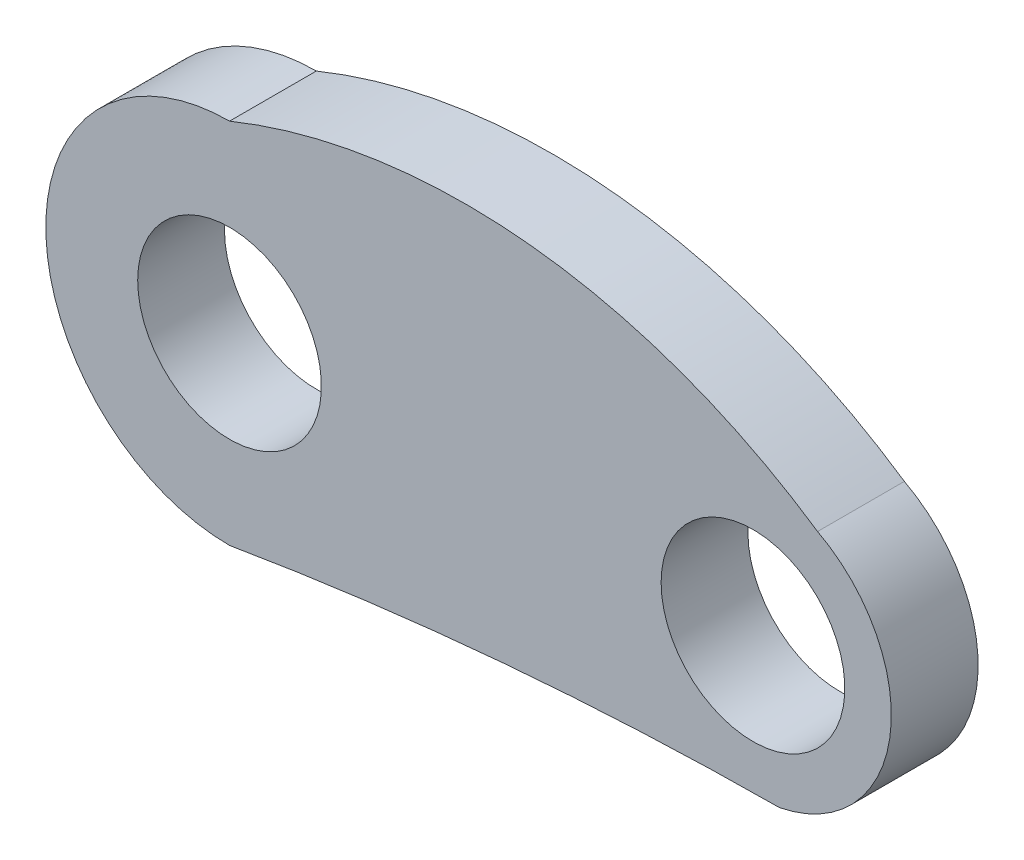
ISO-10303-21;
HEADER;
FILE_DESCRIPTION(('STEP AP214'),'2;1');
FILE_NAME('part.step','',(''),(''),'','','');
FILE_SCHEMA(('AUTOMOTIVE_DESIGN { 1 0 10303 214 1 1 1 1 }'));
ENDSEC;
DATA;
#1=APPLICATION_CONTEXT('core data for automotive mechanical design processes');
#2=APPLICATION_PROTOCOL_DEFINITION('international standard','automotive_design',2000,#1);
#3=PRODUCT_CONTEXT('',#1,'mechanical');
#4=PRODUCT('Part','Part','',(#3));
#5=PRODUCT_RELATED_PRODUCT_CATEGORY('part','',(#4));
#6=PRODUCT_DEFINITION_FORMATION('','',#4);
#7=PRODUCT_DEFINITION_CONTEXT('part definition',#1,'design');
#8=PRODUCT_DEFINITION('design','',#6,#7);
#9=PRODUCT_DEFINITION_SHAPE('','',#8);
#10=(LENGTH_UNIT() NAMED_UNIT(*) SI_UNIT(.MILLI.,.METRE.));
#11=(NAMED_UNIT(*) PLANE_ANGLE_UNIT() SI_UNIT($,.RADIAN.));
#12=(NAMED_UNIT(*) SI_UNIT($,.STERADIAN.) SOLID_ANGLE_UNIT());
#13=UNCERTAINTY_MEASURE_WITH_UNIT(LENGTH_MEASURE(1.E-05),#10,'distance_accuracy_value','');
#14=(GEOMETRIC_REPRESENTATION_CONTEXT(3) GLOBAL_UNCERTAINTY_ASSIGNED_CONTEXT((#13)) GLOBAL_UNIT_ASSIGNED_CONTEXT((#10,
#11,#12)) REPRESENTATION_CONTEXT('',''));
#15=CARTESIAN_POINT('',(0.,0.,0.));
#16=DIRECTION('',(0.,0.,1.));
#17=DIRECTION('',(1.,0.,0.));
#18=AXIS2_PLACEMENT_3D('',#15,#16,#17);
#19=CARTESIAN_POINT('',(4.08793821912339,-6.86584333762435,0.));
#20=DIRECTION('',(0.,0.,1.));
#21=DIRECTION('',(1.,0.,0.));
#22=AXIS2_PLACEMENT_3D('',#19,#20,#21);
#23=PLANE('',#22);
#24=CARTESIAN_POINT('',(0.,0.,0.));
#25=DIRECTION('',(0.,0.,-1.));
#26=DIRECTION('',(-1.,0.,0.));
#27=AXIS2_PLACEMENT_3D('',#24,#25,#26);
#28=CIRCLE('',#27,3.175);
#29=CARTESIAN_POINT('',(-3.175,0.,0.));
#30=VERTEX_POINT('',#29);
#31=EDGE_CURVE('E79',#30,#30,#28,.F.);
#32=ORIENTED_EDGE('',*,*,#31,.T.);
#33=EDGE_LOOP('',(#32));
#34=FACE_BOUND('',#33,.T.);
#35=CARTESIAN_POINT('',(18.09,0.,0.));
#36=DIRECTION('',(0.,0.,-1.));
#37=DIRECTION('',(-1.,0.,0.));
#38=AXIS2_PLACEMENT_3D('',#35,#36,#37);
#39=CIRCLE('',#38,3.175);
#40=CARTESIAN_POINT('',(14.915,0.,0.));
#41=VERTEX_POINT('',#40);
#42=EDGE_CURVE('E20',#41,#41,#39,.F.);
#43=ORIENTED_EDGE('',*,*,#42,.T.);
#44=EDGE_LOOP('',(#43));
#45=FACE_BOUND('',#44,.T.);
#46=CARTESIAN_POINT('',(18.09,0.,0.));
#47=DIRECTION('',(0.,0.,-1.));
#48=DIRECTION('',(-1.,0.,0.));
#49=AXIS2_PLACEMENT_3D('',#46,#47,#48);
#50=CIRCLE('',#49,4.78186189986877);
#51=CARTESIAN_POINT('',(19.0020450023409,-4.69407894513094,0.));
#52=VERTEX_POINT('',#51);
#53=CARTESIAN_POINT('',(20.3228957570764,4.22851980809442,0.));
#54=VERTEX_POINT('',#53);
#55=EDGE_CURVE('E60',#52,#54,#50,.F.);
#56=ORIENTED_EDGE('',*,*,#55,.F.);
#57=CARTESIAN_POINT('',(19.7231550824855,-122.823176962724,0.));
#58=DIRECTION('',(0.,0.,-1.));
#59=DIRECTION('',(-1.,0.,0.));
#60=AXIS2_PLACEMENT_3D('',#57,#58,#59);
#61=CIRCLE('',#60,118.131298977866);
#62=CARTESIAN_POINT('',(0.,-6.34999999999999,0.));
#63=VERTEX_POINT('',#62);
#64=EDGE_CURVE('E74',#52,#63,#61,.F.);
#65=ORIENTED_EDGE('',*,*,#64,.T.);
#66=CARTESIAN_POINT('',(0.,0.,0.));
#67=DIRECTION('',(0.,0.,-1.));
#68=DIRECTION('',(-1.,0.,0.));
#69=AXIS2_PLACEMENT_3D('',#66,#67,#68);
#70=CIRCLE('',#69,6.35);
#71=CARTESIAN_POINT('',(0.,6.35,0.));
#72=VERTEX_POINT('',#71);
#73=EDGE_CURVE('E61',#72,#63,#70,.F.);
#74=ORIENTED_EDGE('',*,*,#73,.F.);
#75=CARTESIAN_POINT('',(8.17587643824678,-13.7316866752487,0.));
#76=DIRECTION('',(0.,0.,-1.));
#77=DIRECTION('',(-1.,0.,0.));
#78=AXIS2_PLACEMENT_3D('',#75,#76,#77);
#79=CIRCLE('',#78,21.6822299419672);
#80=EDGE_CURVE('E56',#54,#72,#79,.F.);
#81=ORIENTED_EDGE('',*,*,#80,.F.);
#82=EDGE_LOOP('',(#56,#65,#74,#81));
#83=FACE_BOUND('',#82,.T.);
#84=ADVANCED_FACE('F17',(#34,#45,#83),#23,.F.);
#85=CARTESIAN_POINT('',(18.09,0.,3.));
#86=DIRECTION('',(0.,0.,-1.));
#87=DIRECTION('',(-1.,0.,0.));
#88=AXIS2_PLACEMENT_3D('',#85,#86,#87);
#89=CYLINDRICAL_SURFACE('',#88,3.175);
#90=CARTESIAN_POINT('',(18.09,0.,3.));
#91=DIRECTION('',(0.,0.,-1.));
#92=DIRECTION('',(-1.,0.,0.));
#93=AXIS2_PLACEMENT_3D('',#90,#91,#92);
#94=CIRCLE('',#93,3.175);
#95=CARTESIAN_POINT('',(14.915,0.,3.));
#96=VERTEX_POINT('',#95);
#97=EDGE_CURVE('E95',#96,#96,#94,.T.);
#98=ORIENTED_EDGE('',*,*,#97,.F.);
#99=EDGE_LOOP('',(#98));
#100=FACE_BOUND('',#99,.T.);
#101=ORIENTED_EDGE('',*,*,#42,.F.);
#102=EDGE_LOOP('',(#101));
#103=FACE_BOUND('',#102,.T.);
#104=ADVANCED_FACE('F126',(#100,#103),#89,.F.);
#105=CARTESIAN_POINT('',(8.17587643824678,-13.7316866752487,3.));
#106=DIRECTION('',(0.,0.,-1.));
#107=DIRECTION('',(-1.,0.,0.));
#108=AXIS2_PLACEMENT_3D('',#105,#106,#107);
#109=CYLINDRICAL_SURFACE('',#108,21.6822299419672);
#110=CARTESIAN_POINT('',(8.17587643824678,-13.7316866752487,3.));
#111=DIRECTION('',(0.,0.,-1.));
#112=DIRECTION('',(-1.,0.,0.));
#113=AXIS2_PLACEMENT_3D('',#110,#111,#112);
#114=CIRCLE('',#113,21.6822299419672);
#115=CARTESIAN_POINT('',(20.3228957570764,4.22851980809442,3.));
#116=VERTEX_POINT('',#115);
#117=CARTESIAN_POINT('',(0.,6.35,3.));
#118=VERTEX_POINT('',#117);
#119=EDGE_CURVE('E69',#116,#118,#114,.F.);
#120=ORIENTED_EDGE('',*,*,#119,.F.);
#121=DIRECTION('',(0.,0.,-1.));
#122=VECTOR('',#121,1.);
#123=CARTESIAN_POINT('',(20.3228957570764,4.22851980809441,3.));
#124=LINE('',#123,#122);
#125=EDGE_CURVE('E66',#54,#116,#124,.F.);
#126=ORIENTED_EDGE('',*,*,#125,.F.);
#127=ORIENTED_EDGE('',*,*,#80,.T.);
#128=DIRECTION('',(0.,0.,-1.));
#129=VECTOR('',#128,1.);
#130=CARTESIAN_POINT('',(0.,6.35,3.));
#131=LINE('',#130,#129);
#132=EDGE_CURVE('E64',#118,#72,#131,.T.);
#133=ORIENTED_EDGE('',*,*,#132,.F.);
#134=EDGE_LOOP('',(#120,#126,#127,#133));
#135=FACE_BOUND('',#134,.T.);
#136=ADVANCED_FACE('F67',(#135),#109,.T.);
#137=CARTESIAN_POINT('',(0.,0.,3.));
#138=DIRECTION('',(0.,0.,-1.));
#139=DIRECTION('',(-1.,0.,0.));
#140=AXIS2_PLACEMENT_3D('',#137,#138,#139);
#141=CYLINDRICAL_SURFACE('',#140,6.35);
#142=ORIENTED_EDGE('',*,*,#73,.T.);
#143=DIRECTION('',(0.,0.,-1.));
#144=VECTOR('',#143,1.);
#145=CARTESIAN_POINT('',(0.,-6.34999999999998,3.));
#146=LINE('',#145,#144);
#147=CARTESIAN_POINT('',(0.,-6.34999999999999,3.));
#148=VERTEX_POINT('',#147);
#149=EDGE_CURVE('E76',#63,#148,#146,.F.);
#150=ORIENTED_EDGE('',*,*,#149,.T.);
#151=CARTESIAN_POINT('',(0.,0.,3.));
#152=DIRECTION('',(0.,0.,-1.));
#153=DIRECTION('',(-1.,0.,0.));
#154=AXIS2_PLACEMENT_3D('',#151,#152,#153);
#155=CIRCLE('',#154,6.35);
#156=EDGE_CURVE('E93',#118,#148,#155,.F.);
#157=ORIENTED_EDGE('',*,*,#156,.F.);
#158=ORIENTED_EDGE('',*,*,#132,.T.);
#159=EDGE_LOOP('',(#142,#150,#157,#158));
#160=FACE_BOUND('',#159,.T.);
#161=ADVANCED_FACE('F122',(#160),#141,.T.);
#162=CARTESIAN_POINT('',(19.7231550824855,-122.823176962724,3.));
#163=DIRECTION('',(0.,0.,-1.));
#164=DIRECTION('',(-1.,0.,0.));
#165=AXIS2_PLACEMENT_3D('',#162,#163,#164);
#166=CYLINDRICAL_SURFACE('',#165,118.131298977866);
#167=DIRECTION('',(0.,0.,-1.));
#168=VECTOR('',#167,1.);
#169=CARTESIAN_POINT('',(19.0020450023408,-4.69407894513095,3.));
#170=LINE('',#169,#168);
#171=CARTESIAN_POINT('',(19.0020450023409,-4.69407894513094,3.));
#172=VERTEX_POINT('',#171);
#173=EDGE_CURVE('E35',#172,#52,#170,.T.);
#174=ORIENTED_EDGE('',*,*,#173,.F.);
#175=CARTESIAN_POINT('',(19.7231550824855,-122.823176962724,3.));
#176=DIRECTION('',(0.,0.,-1.));
#177=DIRECTION('',(-1.,0.,0.));
#178=AXIS2_PLACEMENT_3D('',#175,#176,#177);
#179=CIRCLE('',#178,118.131298977866);
#180=EDGE_CURVE('E90',#148,#172,#179,.T.);
#181=ORIENTED_EDGE('',*,*,#180,.F.);
#182=ORIENTED_EDGE('',*,*,#149,.F.);
#183=ORIENTED_EDGE('',*,*,#64,.F.);
#184=EDGE_LOOP('',(#174,#181,#182,#183));
#185=FACE_BOUND('',#184,.T.);
#186=ADVANCED_FACE('F116',(#185),#166,.F.);
#187=CARTESIAN_POINT('',(18.09,0.,3.));
#188=DIRECTION('',(0.,0.,-1.));
#189=DIRECTION('',(-1.,0.,0.));
#190=AXIS2_PLACEMENT_3D('',#187,#188,#189);
#191=CYLINDRICAL_SURFACE('',#190,4.78186189986877);
#192=CARTESIAN_POINT('',(18.09,0.,3.));
#193=DIRECTION('',(0.,0.,-1.));
#194=DIRECTION('',(-1.,0.,0.));
#195=AXIS2_PLACEMENT_3D('',#192,#193,#194);
#196=CIRCLE('',#195,4.78186189986877);
#197=EDGE_CURVE('E26',#172,#116,#196,.F.);
#198=ORIENTED_EDGE('',*,*,#197,.F.);
#199=ORIENTED_EDGE('',*,*,#173,.T.);
#200=ORIENTED_EDGE('',*,*,#55,.T.);
#201=ORIENTED_EDGE('',*,*,#125,.T.);
#202=EDGE_LOOP('',(#198,#199,#200,#201));
#203=FACE_BOUND('',#202,.T.);
#204=ADVANCED_FACE('F73',(#203),#191,.T.);
#205=CARTESIAN_POINT('',(0.,0.,3.));
#206=DIRECTION('',(0.,0.,-1.));
#207=DIRECTION('',(-1.,0.,0.));
#208=AXIS2_PLACEMENT_3D('',#205,#206,#207);
#209=CYLINDRICAL_SURFACE('',#208,3.175);
#210=CARTESIAN_POINT('',(0.,0.,3.));
#211=DIRECTION('',(0.,0.,-1.));
#212=DIRECTION('',(-1.,0.,0.));
#213=AXIS2_PLACEMENT_3D('',#210,#211,#212);
#214=CIRCLE('',#213,3.175);
#215=CARTESIAN_POINT('',(-3.175,0.,3.));
#216=VERTEX_POINT('',#215);
#217=EDGE_CURVE('E11',#216,#216,#214,.T.);
#218=ORIENTED_EDGE('',*,*,#217,.F.);
#219=EDGE_LOOP('',(#218));
#220=FACE_BOUND('',#219,.T.);
#221=ORIENTED_EDGE('',*,*,#31,.F.);
#222=EDGE_LOOP('',(#221));
#223=FACE_BOUND('',#222,.T.);
#224=ADVANCED_FACE('F104',(#220,#223),#209,.F.);
#225=CARTESIAN_POINT('',(4.08793821912339,-6.86584333762435,3.));
#226=DIRECTION('',(0.,0.,1.));
#227=DIRECTION('',(1.,0.,0.));
#228=AXIS2_PLACEMENT_3D('',#225,#226,#227);
#229=PLANE('',#228);
#230=ORIENTED_EDGE('',*,*,#217,.T.);
#231=EDGE_LOOP('',(#230));
#232=FACE_BOUND('',#231,.T.);
#233=ORIENTED_EDGE('',*,*,#180,.T.);
#234=ORIENTED_EDGE('',*,*,#197,.T.);
#235=ORIENTED_EDGE('',*,*,#119,.T.);
#236=ORIENTED_EDGE('',*,*,#156,.T.);
#237=EDGE_LOOP('',(#233,#234,#235,#236));
#238=FACE_BOUND('',#237,.T.);
#239=ORIENTED_EDGE('',*,*,#97,.T.);
#240=EDGE_LOOP('',(#239));
#241=FACE_BOUND('',#240,.T.);
#242=ADVANCED_FACE('F106',(#232,#238,#241),#229,.T.);
#243=CLOSED_SHELL('',(#84,#104,#136,#161,#186,#204,#224,#242));
#244=MANIFOLD_SOLID_BREP('B1',#243);
#245=ADVANCED_BREP_SHAPE_REPRESENTATION('',(#18,#244),#14);
#246=SHAPE_DEFINITION_REPRESENTATION(#9,#245);
ENDSEC;
END-ISO-10303-21;
